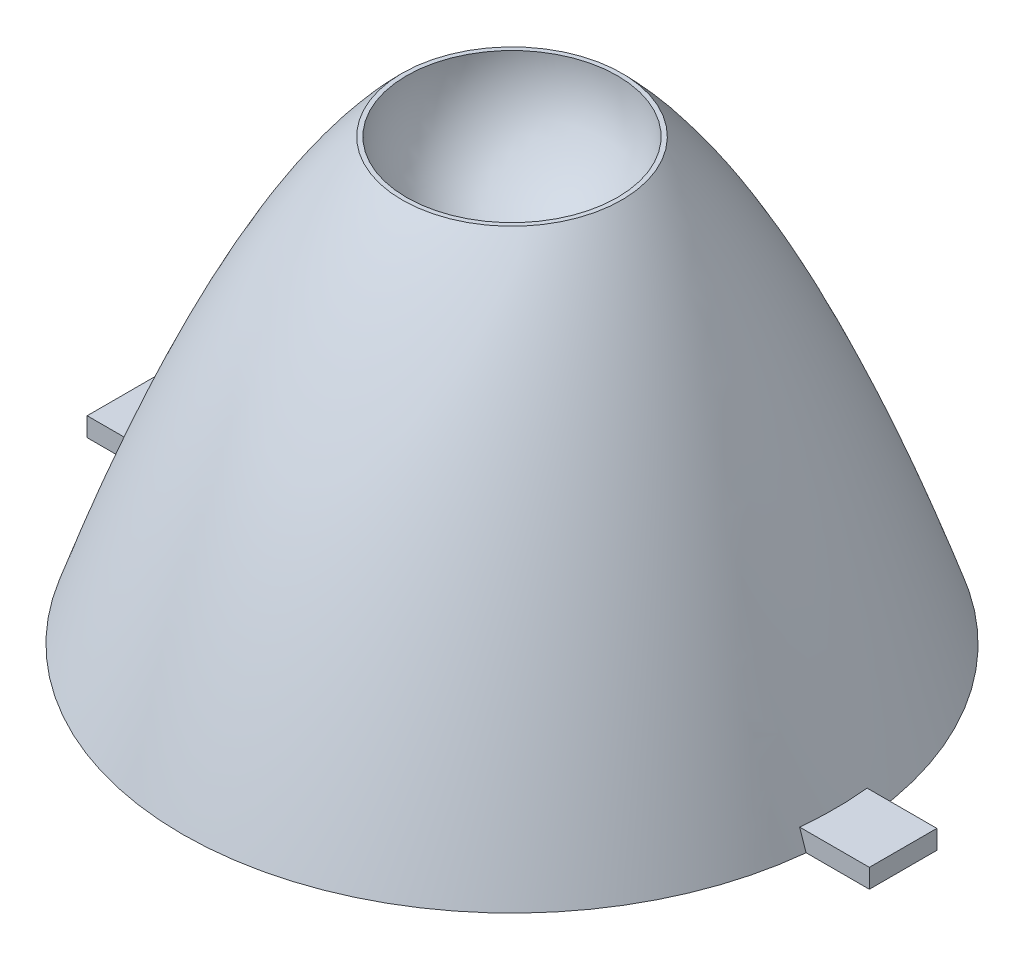
ISO-10303-21;
HEADER;
FILE_DESCRIPTION(('STEP AP214'),'2;1');
FILE_NAME('part.step','',(''),(''),'','','');
FILE_SCHEMA(('AUTOMOTIVE_DESIGN { 1 0 10303 214 1 1 1 1 }'));
ENDSEC;
DATA;
#1=APPLICATION_CONTEXT('core data for automotive mechanical design processes');
#2=APPLICATION_PROTOCOL_DEFINITION('international standard','automotive_design',2000,#1);
#3=PRODUCT_CONTEXT('',#1,'mechanical');
#4=PRODUCT('Part','Part','',(#3));
#5=PRODUCT_RELATED_PRODUCT_CATEGORY('part','',(#4));
#6=PRODUCT_DEFINITION_FORMATION('','',#4);
#7=PRODUCT_DEFINITION_CONTEXT('part definition',#1,'design');
#8=PRODUCT_DEFINITION('design','',#6,#7);
#9=PRODUCT_DEFINITION_SHAPE('','',#8);
#10=(LENGTH_UNIT() NAMED_UNIT(*) SI_UNIT(.MILLI.,.METRE.));
#11=(NAMED_UNIT(*) PLANE_ANGLE_UNIT() SI_UNIT($,.RADIAN.));
#12=(NAMED_UNIT(*) SI_UNIT($,.STERADIAN.) SOLID_ANGLE_UNIT());
#13=UNCERTAINTY_MEASURE_WITH_UNIT(LENGTH_MEASURE(1.E-05),#10,'distance_accuracy_value','');
#14=(GEOMETRIC_REPRESENTATION_CONTEXT(3) GLOBAL_UNCERTAINTY_ASSIGNED_CONTEXT((#13)) GLOBAL_UNIT_ASSIGNED_CONTEXT((#10,
#11,#12)) REPRESENTATION_CONTEXT('',''));
#15=CARTESIAN_POINT('',(0.,0.,0.));
#16=DIRECTION('',(0.,0.,1.));
#17=DIRECTION('',(1.,0.,0.));
#18=AXIS2_PLACEMENT_3D('',#15,#16,#17);
#19=CARTESIAN_POINT('',(9.52499953652833,-12.7,0.));
#20=CARTESIAN_POINT('',(8.98658951193454,-11.0889852593724,0.));
#21=CARTESIAN_POINT('',(8.21607077891812,-8.9459675211616,0.));
#22=CARTESIAN_POINT('',(7.14349645215366,-6.42727389875861,0.));
#23=CARTESIAN_POINT('',(6.54609687080314,-5.1447379623066,0.));
#24=CARTESIAN_POINT('',(6.02606113528694,-4.11883898989032,0.));
#25=CARTESIAN_POINT('',(5.56823091563335,-3.2855566715019,0.));
#26=CARTESIAN_POINT('',(5.16117659576394,-2.59971110349342,0.));
#27=CARTESIAN_POINT('',(4.79609255734939,-2.02868317302729,0.));
#28=CARTESIAN_POINT('',(4.46608630281755,-1.54843535793217,0.));
#29=CARTESIAN_POINT('',(4.16568225705919,-1.14093785920337,0.));
#30=CARTESIAN_POINT('',(3.89047272535403,-0.79244982453231,0.));
#31=CARTESIAN_POINT('',(3.56950650567792,-0.412648032754939,0.));
#32=CARTESIAN_POINT('',(3.33084137116252,-0.155867529495728,0.));
#33=CARTESIAN_POINT('',(3.17500559236024,-5.53856793887911E-06,0.));
#34=B_SPLINE_CURVE_WITH_KNOTS('',3,(#19,#20,#21,#22,#23,#24,#25,#26,#27,#28,#29,#30,#31,#32,
#33),.UNSPECIFIED.,.F.,.F.,(4,1,1,1,1,1,1,1,1,1,1,1,4),(0.,0.356352412576352,0.477293422752833,
0.574115343623723,0.65307278056364,0.718507442353122,0.773510539224903,0.820333182326071,
0.860646820103556,0.895714403010185,0.926505158079893,0.953773420464535,1.),.UNSPECIFIED.);
#35=CARTESIAN_POINT('',(0.,-1.12631556615233,0.));
#36=DIRECTION('',(0.,1.,0.));
#37=AXIS1_PLACEMENT('',#35,#36);
#38=SURFACE_OF_REVOLUTION('',#34,#37);
#39=CARTESIAN_POINT('',(0.,-5.5385679393477E-06,0.));
#40=DIRECTION('',(0.,1.,0.));
#41=DIRECTION('',(-1.,0.,0.));
#42=AXIS2_PLACEMENT_3D('',#39,#40,#41);
#43=CIRCLE('',#42,3.17500559236024);
#44=CARTESIAN_POINT('',(-3.17500559236024,-5.53856793973653E-06,0.));
#45=VERTEX_POINT('',#44);
#46=EDGE_CURVE('E236',#45,#45,#43,.T.);
#47=ORIENTED_EDGE('',*,*,#46,.F.);
#48=EDGE_LOOP('',(#47));
#49=FACE_BOUND('',#48,.T.);
#50=CARTESIAN_POINT('',(-9.4749665524932,-12.7,-0.975000000000001));
#51=CARTESIAN_POINT('',(-9.44414504023175,-12.6082477857635,-0.975000000000001));
#52=CARTESIAN_POINT('',(-9.41319734704189,-12.5165383453119,-0.975000000000001));
#53=CARTESIAN_POINT('',(-9.35104959880534,-12.3332050119786,-0.975000000000002));
#54=CARTESIAN_POINT('',(-9.31984954375866,-12.2415811190968,-0.975000000000002));
#55=CARTESIAN_POINT('',(-9.28852330778356,-12.15,-0.975000000000003));
#56=B_SPLINE_CURVE_WITH_KNOTS('',3,(#50,#51,#52,#53,#54,#55),.UNSPECIFIED.,.F.,.F.,(4,2,4),(0.,
0.290371194569067,0.580742389138133),.UNSPECIFIED.);
#57=CARTESIAN_POINT('',(-9.4749665524932,-12.7,-0.975000000000001));
#58=VERTEX_POINT('',#57);
#59=CARTESIAN_POINT('',(-9.28852330778355,-12.15,-0.975000000000002));
#60=VERTEX_POINT('',#59);
#61=EDGE_CURVE('E61',#58,#60,#56,.T.);
#62=ORIENTED_EDGE('',*,*,#61,.T.);
#63=CARTESIAN_POINT('',(0.,-12.15,0.));
#64=DIRECTION('',(0.,1.,0.));
#65=DIRECTION('',(-1.,0.,0.));
#66=AXIS2_PLACEMENT_3D('',#63,#64,#65);
#67=CIRCLE('',#66,9.33955514139931);
#68=CARTESIAN_POINT('',(-9.28852330778355,-12.15,0.974999999999998));
#69=VERTEX_POINT('',#68);
#70=EDGE_CURVE('E149',#60,#69,#67,.T.);
#71=ORIENTED_EDGE('',*,*,#70,.T.);
#72=CARTESIAN_POINT('',(-9.28852330778355,-12.15,0.974999999999999));
#73=CARTESIAN_POINT('',(-9.31984954375865,-12.2415811190968,0.974999999999999));
#74=CARTESIAN_POINT('',(-9.35104959880533,-12.3332050119785,0.974999999999999));
#75=CARTESIAN_POINT('',(-9.41319734704188,-12.5165383453119,0.974999999999998));
#76=CARTESIAN_POINT('',(-9.44414504023175,-12.6082477857635,0.974999999999997));
#77=CARTESIAN_POINT('',(-9.4749665524932,-12.7,0.974999999999997));
#78=B_SPLINE_CURVE_WITH_KNOTS('',3,(#72,#73,#74,#75,#76,#77),.UNSPECIFIED.,.F.,.F.,(4,2,4),(0.,
0.290371194569084,0.580742389138167),.UNSPECIFIED.);
#79=CARTESIAN_POINT('',(-9.4749665524932,-12.7,0.974999999999998));
#80=VERTEX_POINT('',#79);
#81=EDGE_CURVE('E67',#69,#80,#78,.T.);
#82=ORIENTED_EDGE('',*,*,#81,.T.);
#83=CARTESIAN_POINT('',(0.,-12.7,0.));
#84=DIRECTION('',(0.,1.,0.));
#85=DIRECTION('',(-1.,0.,0.));
#86=AXIS2_PLACEMENT_3D('',#83,#84,#85);
#87=CIRCLE('',#86,9.52499953652833);
#88=CARTESIAN_POINT('',(9.4749665524932,-12.7,0.974999999999998));
#89=VERTEX_POINT('',#88);
#90=EDGE_CURVE('E234',#80,#89,#87,.T.);
#91=ORIENTED_EDGE('',*,*,#90,.T.);
#92=CARTESIAN_POINT('',(9.2885233077836,-12.15,0.974999999999939));
#93=CARTESIAN_POINT('',(9.31984954375868,-12.2415811190968,0.974999999999969));
#94=CARTESIAN_POINT('',(9.35104959880535,-12.3332050119785,0.974999999999989));
#95=CARTESIAN_POINT('',(9.41319734704189,-12.5165383453119,0.975000000000008));
#96=CARTESIAN_POINT('',(9.44414504023175,-12.6082477857635,0.975000000000007));
#97=CARTESIAN_POINT('',(9.4749665524932,-12.7,0.974999999999995));
#98=B_SPLINE_CURVE_WITH_KNOTS('',3,(#92,#93,#94,#95,#96,#97),.UNSPECIFIED.,.F.,.F.,(4,2,4),(0.,
0.290371194569064,0.580742389138129),.UNSPECIFIED.);
#99=CARTESIAN_POINT('',(9.28852330778356,-12.15,0.974999999999996));
#100=VERTEX_POINT('',#99);
#101=EDGE_CURVE('E164',#100,#89,#98,.T.);
#102=ORIENTED_EDGE('',*,*,#101,.F.);
#103=CARTESIAN_POINT('',(0.,-12.15,0.));
#104=DIRECTION('',(0.,1.,0.));
#105=DIRECTION('',(-1.,0.,0.));
#106=AXIS2_PLACEMENT_3D('',#103,#104,#105);
#107=CIRCLE('',#106,9.33955514139931);
#108=CARTESIAN_POINT('',(9.28852330778356,-12.15,-0.975000000000001));
#109=VERTEX_POINT('',#108);
#110=EDGE_CURVE('E200',#109,#100,#107,.F.);
#111=ORIENTED_EDGE('',*,*,#110,.F.);
#112=CARTESIAN_POINT('',(9.47496655249321,-12.7,-0.975000000000001));
#113=CARTESIAN_POINT('',(9.44414504023175,-12.6082477857635,-0.975000000000001));
#114=CARTESIAN_POINT('',(9.41319734704189,-12.5165383453119,-0.975000000000001));
#115=CARTESIAN_POINT('',(9.35104959880534,-12.3332050119785,-0.975000000000001));
#116=CARTESIAN_POINT('',(9.31984954375865,-12.2415811190968,-0.975000000000001));
#117=CARTESIAN_POINT('',(9.28852330778356,-12.15,-0.975000000000001));
#118=B_SPLINE_CURVE_WITH_KNOTS('',3,(#112,#113,#114,#115,#116,#117),.UNSPECIFIED.,.F.,.F.,(4,2,
4),(0.,0.290371194569082,0.580742389138167),.UNSPECIFIED.);
#119=CARTESIAN_POINT('',(9.4749665524932,-12.7,-0.975000000000001));
#120=VERTEX_POINT('',#119);
#121=EDGE_CURVE('E175',#120,#109,#118,.T.);
#122=ORIENTED_EDGE('',*,*,#121,.F.);
#123=EDGE_CURVE('E233',#120,#58,#87,.T.);
#124=ORIENTED_EDGE('',*,*,#123,.T.);
#125=EDGE_LOOP('',(#62,#71,#82,#91,#102,#111,#122,#124));
#126=FACE_BOUND('',#125,.T.);
#127=ADVANCED_FACE('F46',(#49,#126),#38,.T.);
#128=CARTESIAN_POINT('',(1.64846835996421E-07,-3.51991186051879,0.));
#129=DIRECTION('',(0.,1.,0.));
#130=DIRECTION('',(-1.,0.,0.));
#131=AXIS2_PLACEMENT_3D('',#128,#129,#130);
#132=SPHERICAL_SURFACE('',#131,3.22775418252435);
#133=CARTESIAN_POINT('',(0.,-4.19100054502488,0.));
#134=DIRECTION('',(0.,1.,0.));
#135=DIRECTION('',(-1.,0.,0.));
#136=AXIS2_PLACEMENT_3D('',#133,#134,#135);
#137=CIRCLE('',#136,3.15721999253248);
#138=CARTESIAN_POINT('',(-3.15721999253247,-4.19100054502488,0.));
#139=VERTEX_POINT('',#138);
#140=EDGE_CURVE('E13',#139,#139,#137,.T.);
#141=ORIENTED_EDGE('',*,*,#140,.F.);
#142=EDGE_LOOP('',(#141));
#143=FACE_BOUND('',#142,.T.);
#144=ADVANCED_FACE('F48',(#143),#132,.T.);
#145=CARTESIAN_POINT('',(0.,-4.19100054502488,0.));
#146=DIRECTION('',(0.,-1.,0.));
#147=DIRECTION('',(1.,0.,0.));
#148=AXIS2_PLACEMENT_3D('',#145,#146,#147);
#149=CONICAL_SURFACE('',#148,3.15721999253248,0.0174532925199428);
#150=CARTESIAN_POINT('',(0.,-12.7,0.));
#151=DIRECTION('',(0.,1.,0.));
#152=DIRECTION('',(-1.,0.,0.));
#153=AXIS2_PLACEMENT_3D('',#150,#151,#152);
#154=CIRCLE('',#153,3.30574513049323);
#155=CARTESIAN_POINT('',(-3.30574513049323,-12.7,0.));
#156=VERTEX_POINT('',#155);
#157=EDGE_CURVE('E54',#156,#156,#154,.T.);
#158=ORIENTED_EDGE('',*,*,#157,.F.);
#159=EDGE_LOOP('',(#158));
#160=FACE_BOUND('',#159,.T.);
#161=ORIENTED_EDGE('',*,*,#140,.T.);
#162=EDGE_LOOP('',(#161));
#163=FACE_BOUND('',#162,.T.);
#164=ADVANCED_FACE('F220',(#160,#163),#149,.F.);
#165=CARTESIAN_POINT('',(3.30574513049323,-12.7,0.));
#166=DIRECTION('',(0.,1.,0.));
#167=DIRECTION('',(-1.,0.,0.));
#168=AXIS2_PLACEMENT_3D('',#165,#166,#167);
#169=PLANE('',#168);
#170=ORIENTED_EDGE('',*,*,#123,.F.);
#171=DIRECTION('',(1.,0.,0.));
#172=VECTOR('',#171,1.);
#173=CARTESIAN_POINT('',(-9.52599953652833,-12.7,-0.975000000000001));
#174=LINE('',#173,#172);
#175=CARTESIAN_POINT('',(11.3025,-12.7,-0.975000000000001));
#176=VERTEX_POINT('',#175);
#177=EDGE_CURVE('E155',#120,#176,#174,.T.);
#178=ORIENTED_EDGE('',*,*,#177,.T.);
#179=DIRECTION('',(0.,0.,-1.));
#180=VECTOR('',#179,1.);
#181=CARTESIAN_POINT('',(11.3025,-12.7,0.974999999999998));
#182=LINE('',#181,#180);
#183=CARTESIAN_POINT('',(11.3025,-12.7,0.974999999999998));
#184=VERTEX_POINT('',#183);
#185=EDGE_CURVE('E159',#184,#176,#182,.T.);
#186=ORIENTED_EDGE('',*,*,#185,.F.);
#187=DIRECTION('',(1.,0.,0.));
#188=VECTOR('',#187,1.);
#189=CARTESIAN_POINT('',(-9.52599953652833,-12.7,0.974999999999998));
#190=LINE('',#189,#188);
#191=EDGE_CURVE('E173',#89,#184,#190,.T.);
#192=ORIENTED_EDGE('',*,*,#191,.F.);
#193=ORIENTED_EDGE('',*,*,#90,.F.);
#194=DIRECTION('',(-1.,0.,0.));
#195=VECTOR('',#194,1.);
#196=CARTESIAN_POINT('',(11.3035,-12.7,0.974999999999998));
#197=LINE('',#196,#195);
#198=CARTESIAN_POINT('',(-11.3025,-12.7,0.974999999999998));
#199=VERTEX_POINT('',#198);
#200=EDGE_CURVE('E144',#80,#199,#197,.T.);
#201=ORIENTED_EDGE('',*,*,#200,.T.);
#202=DIRECTION('',(0.,0.,-1.));
#203=VECTOR('',#202,1.);
#204=CARTESIAN_POINT('',(-11.3025,-12.7,0.974999999999998));
#205=LINE('',#204,#203);
#206=CARTESIAN_POINT('',(-11.3025,-12.7,-0.975000000000001));
#207=VERTEX_POINT('',#206);
#208=EDGE_CURVE('E119',#199,#207,#205,.T.);
#209=ORIENTED_EDGE('',*,*,#208,.T.);
#210=DIRECTION('',(-1.,0.,0.));
#211=VECTOR('',#210,1.);
#212=CARTESIAN_POINT('',(11.3035,-12.7,-0.975000000000001));
#213=LINE('',#212,#211);
#214=EDGE_CURVE('E146',#58,#207,#213,.T.);
#215=ORIENTED_EDGE('',*,*,#214,.F.);
#216=EDGE_LOOP('',(#170,#178,#186,#192,#193,#201,#209,#215));
#217=FACE_BOUND('',#216,.T.);
#218=ORIENTED_EDGE('',*,*,#157,.T.);
#219=EDGE_LOOP('',(#218));
#220=FACE_BOUND('',#219,.T.);
#221=ADVANCED_FACE('F218',(#217,#220),#169,.F.);
#222=CARTESIAN_POINT('',(3.17500559236024,-2.90251626409531E-06,0.));
#223=DIRECTION('',(0.,-1.,0.));
#224=DIRECTION('',(1.,0.,0.));
#225=AXIS2_PLACEMENT_3D('',#222,#223,#224);
#226=PLANE('',#225);
#227=CARTESIAN_POINT('',(0.,-2.66464589759527E-07,0.));
#228=DIRECTION('',(0.,1.,0.));
#229=DIRECTION('',(-1.,0.,0.));
#230=AXIS2_PLACEMENT_3D('',#227,#228,#229);
#231=CIRCLE('',#230,3.04800022537921);
#232=CARTESIAN_POINT('',(-3.04800022537921,-2.66464590132799E-07,0.));
#233=VERTEX_POINT('',#232);
#234=EDGE_CURVE('E198',#233,#233,#231,.T.);
#235=ORIENTED_EDGE('',*,*,#234,.F.);
#236=EDGE_LOOP('',(#235));
#237=FACE_BOUND('',#236,.T.);
#238=ORIENTED_EDGE('',*,*,#46,.T.);
#239=EDGE_LOOP('',(#238));
#240=FACE_BOUND('',#239,.T.);
#241=ADVANCED_FACE('F217',(#237,#240),#226,.F.);
#242=CARTESIAN_POINT('',(4.63603143451697E-07,-3.59340582441221E-07,0.));
#243=DIRECTION('',(0.,1.,0.));
#244=DIRECTION('',(1.,0.,0.));
#245=AXIS2_PLACEMENT_3D('',#242,#243,#244);
#246=SPHERICAL_SURFACE('',#245,3.04799976177607);
#247=ORIENTED_EDGE('',*,*,#234,.T.);
#248=EDGE_LOOP('',(#247));
#249=FACE_BOUND('',#248,.T.);
#250=ADVANCED_FACE('F187',(#249),#246,.F.);
#251=CARTESIAN_POINT('',(11.3025,0.,0.));
#252=DIRECTION('',(-1.,0.,0.));
#253=DIRECTION('',(0.,0.,1.));
#254=AXIS2_PLACEMENT_3D('',#251,#252,#253);
#255=PLANE('',#254);
#256=DIRECTION('',(0.,-1.,0.));
#257=VECTOR('',#256,1.);
#258=CARTESIAN_POINT('',(11.3025,-12.7,0.974999999999998));
#259=LINE('',#258,#257);
#260=CARTESIAN_POINT('',(11.3025,-12.15,0.974999999999998));
#261=VERTEX_POINT('',#260);
#262=EDGE_CURVE('E151',#261,#184,#259,.T.);
#263=ORIENTED_EDGE('',*,*,#262,.T.);
#264=ORIENTED_EDGE('',*,*,#185,.T.);
#265=DIRECTION('',(0.,1.,0.));
#266=VECTOR('',#265,1.);
#267=CARTESIAN_POINT('',(11.3025,-12.7,-0.975000000000001));
#268=LINE('',#267,#266);
#269=CARTESIAN_POINT('',(11.3025,-12.15,-0.975000000000001));
#270=VERTEX_POINT('',#269);
#271=EDGE_CURVE('E156',#176,#270,#268,.T.);
#272=ORIENTED_EDGE('',*,*,#271,.T.);
#273=DIRECTION('',(0.,0.,1.));
#274=VECTOR('',#273,1.);
#275=CARTESIAN_POINT('',(11.3025,-12.15,0.974999999999998));
#276=LINE('',#275,#274);
#277=EDGE_CURVE('E152',#270,#261,#276,.T.);
#278=ORIENTED_EDGE('',*,*,#277,.T.);
#279=EDGE_LOOP('',(#263,#264,#272,#278));
#280=FACE_BOUND('',#279,.T.);
#281=ADVANCED_FACE('F248',(#280),#255,.F.);
#282=CARTESIAN_POINT('',(-9.52599953652833,-12.7,-0.975000000000001));
#283=DIRECTION('',(0.,0.,-1.));
#284=DIRECTION('',(-1.,0.,0.));
#285=AXIS2_PLACEMENT_3D('',#282,#283,#284);
#286=PLANE('',#285);
#287=ORIENTED_EDGE('',*,*,#177,.F.);
#288=ORIENTED_EDGE('',*,*,#121,.T.);
#289=DIRECTION('',(1.,0.,0.));
#290=VECTOR('',#289,1.);
#291=CARTESIAN_POINT('',(-9.52599953652833,-12.15,-0.975000000000001));
#292=LINE('',#291,#290);
#293=EDGE_CURVE('E202',#109,#270,#292,.T.);
#294=ORIENTED_EDGE('',*,*,#293,.T.);
#295=ORIENTED_EDGE('',*,*,#271,.F.);
#296=EDGE_LOOP('',(#287,#288,#294,#295));
#297=FACE_BOUND('',#296,.T.);
#298=ADVANCED_FACE('F252',(#297),#286,.T.);
#299=CARTESIAN_POINT('',(-9.52599953652833,-12.15,0.974999999999998));
#300=DIRECTION('',(0.,1.,0.));
#301=DIRECTION('',(0.,0.,1.));
#302=AXIS2_PLACEMENT_3D('',#299,#300,#301);
#303=PLANE('',#302);
#304=ORIENTED_EDGE('',*,*,#293,.F.);
#305=ORIENTED_EDGE('',*,*,#110,.T.);
#306=DIRECTION('',(1.,0.,0.));
#307=VECTOR('',#306,1.);
#308=CARTESIAN_POINT('',(-9.52599953652833,-12.15,0.974999999999998));
#309=LINE('',#308,#307);
#310=EDGE_CURVE('E174',#100,#261,#309,.T.);
#311=ORIENTED_EDGE('',*,*,#310,.T.);
#312=ORIENTED_EDGE('',*,*,#277,.F.);
#313=EDGE_LOOP('',(#304,#305,#311,#312));
#314=FACE_BOUND('',#313,.T.);
#315=ADVANCED_FACE('F258',(#314),#303,.T.);
#316=CARTESIAN_POINT('',(-9.52599953652833,-12.7,0.974999999999998));
#317=DIRECTION('',(0.,0.,1.));
#318=DIRECTION('',(1.,0.,0.));
#319=AXIS2_PLACEMENT_3D('',#316,#317,#318);
#320=PLANE('',#319);
#321=ORIENTED_EDGE('',*,*,#310,.F.);
#322=ORIENTED_EDGE('',*,*,#101,.T.);
#323=ORIENTED_EDGE('',*,*,#191,.T.);
#324=ORIENTED_EDGE('',*,*,#262,.F.);
#325=EDGE_LOOP('',(#321,#322,#323,#324));
#326=FACE_BOUND('',#325,.T.);
#327=ADVANCED_FACE('F182',(#326),#320,.T.);
#328=CARTESIAN_POINT('',(-11.3025,0.,0.));
#329=DIRECTION('',(1.,0.,0.));
#330=DIRECTION('',(0.,0.,1.));
#331=AXIS2_PLACEMENT_3D('',#328,#329,#330);
#332=PLANE('',#331);
#333=DIRECTION('',(0.,-1.,0.));
#334=VECTOR('',#333,1.);
#335=CARTESIAN_POINT('',(-11.3025,-12.7,0.974999999999998));
#336=LINE('',#335,#334);
#337=CARTESIAN_POINT('',(-11.3025,-12.15,0.974999999999998));
#338=VERTEX_POINT('',#337);
#339=EDGE_CURVE('E115',#338,#199,#336,.T.);
#340=ORIENTED_EDGE('',*,*,#339,.F.);
#341=DIRECTION('',(0.,0.,1.));
#342=VECTOR('',#341,1.);
#343=CARTESIAN_POINT('',(-11.3025,-12.15,0.974999999999998));
#344=LINE('',#343,#342);
#345=CARTESIAN_POINT('',(-11.3025,-12.15,-0.975000000000001));
#346=VERTEX_POINT('',#345);
#347=EDGE_CURVE('E122',#346,#338,#344,.T.);
#348=ORIENTED_EDGE('',*,*,#347,.F.);
#349=DIRECTION('',(0.,1.,0.));
#350=VECTOR('',#349,1.);
#351=CARTESIAN_POINT('',(-11.3025,-12.7,-0.975000000000001));
#352=LINE('',#351,#350);
#353=EDGE_CURVE('E127',#207,#346,#352,.T.);
#354=ORIENTED_EDGE('',*,*,#353,.F.);
#355=ORIENTED_EDGE('',*,*,#208,.F.);
#356=EDGE_LOOP('',(#340,#348,#354,#355));
#357=FACE_BOUND('',#356,.T.);
#358=ADVANCED_FACE('F130',(#357),#332,.F.);
#359=CARTESIAN_POINT('',(11.3035,-12.15,0.974999999999998));
#360=DIRECTION('',(0.,-1.,0.));
#361=DIRECTION('',(0.,0.,-1.));
#362=AXIS2_PLACEMENT_3D('',#359,#360,#361);
#363=PLANE('',#362);
#364=ORIENTED_EDGE('',*,*,#70,.F.);
#365=DIRECTION('',(-1.,0.,0.));
#366=VECTOR('',#365,1.);
#367=CARTESIAN_POINT('',(11.3035,-12.15,-0.975000000000001));
#368=LINE('',#367,#366);
#369=EDGE_CURVE('E118',#60,#346,#368,.T.);
#370=ORIENTED_EDGE('',*,*,#369,.T.);
#371=ORIENTED_EDGE('',*,*,#347,.T.);
#372=DIRECTION('',(-1.,0.,0.));
#373=VECTOR('',#372,1.);
#374=CARTESIAN_POINT('',(11.3035,-12.15,0.974999999999998));
#375=LINE('',#374,#373);
#376=EDGE_CURVE('E110',#69,#338,#375,.T.);
#377=ORIENTED_EDGE('',*,*,#376,.F.);
#378=EDGE_LOOP('',(#364,#370,#371,#377));
#379=FACE_BOUND('',#378,.T.);
#380=ADVANCED_FACE('F123',(#379),#363,.F.);
#381=CARTESIAN_POINT('',(11.3035,-12.7,-0.975000000000001));
#382=DIRECTION('',(0.,0.,1.));
#383=DIRECTION('',(1.,0.,0.));
#384=AXIS2_PLACEMENT_3D('',#381,#382,#383);
#385=PLANE('',#384);
#386=ORIENTED_EDGE('',*,*,#61,.F.);
#387=ORIENTED_EDGE('',*,*,#214,.T.);
#388=ORIENTED_EDGE('',*,*,#353,.T.);
#389=ORIENTED_EDGE('',*,*,#369,.F.);
#390=EDGE_LOOP('',(#386,#387,#388,#389));
#391=FACE_BOUND('',#390,.T.);
#392=ADVANCED_FACE('F282',(#391),#385,.F.);
#393=CARTESIAN_POINT('',(11.3035,-12.7,0.974999999999998));
#394=DIRECTION('',(0.,0.,-1.));
#395=DIRECTION('',(-1.,0.,0.));
#396=AXIS2_PLACEMENT_3D('',#393,#394,#395);
#397=PLANE('',#396);
#398=ORIENTED_EDGE('',*,*,#81,.F.);
#399=ORIENTED_EDGE('',*,*,#376,.T.);
#400=ORIENTED_EDGE('',*,*,#339,.T.);
#401=ORIENTED_EDGE('',*,*,#200,.F.);
#402=EDGE_LOOP('',(#398,#399,#400,#401));
#403=FACE_BOUND('',#402,.T.);
#404=ADVANCED_FACE('F112',(#403),#397,.F.);
#405=CLOSED_SHELL('',(#127,#144,#164,#221,#241,#250,#281,#298,#315,#327,#358,#380,#392,#404));
#406=MANIFOLD_SOLID_BREP('B2',#405);
#407=ADVANCED_BREP_SHAPE_REPRESENTATION('',(#18,#406),#14);
#408=SHAPE_DEFINITION_REPRESENTATION(#9,#407);
ENDSEC;
END-ISO-10303-21;
